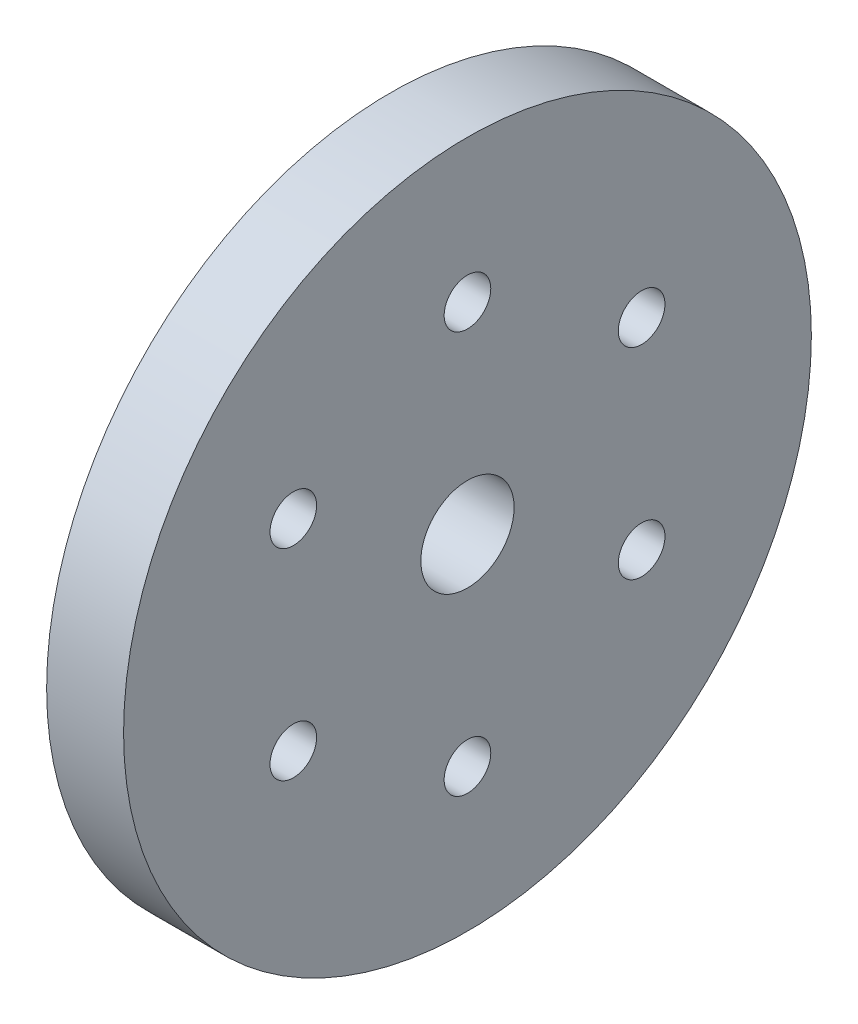
ISO-10303-21;
HEADER;
FILE_DESCRIPTION(('STEP AP214'),'2;1');
FILE_NAME('part.step','',(''),(''),'','','');
FILE_SCHEMA(('AUTOMOTIVE_DESIGN { 1 0 10303 214 1 1 1 1 }'));
ENDSEC;
DATA;
#1=APPLICATION_CONTEXT('core data for automotive mechanical design processes');
#2=APPLICATION_PROTOCOL_DEFINITION('international standard','automotive_design',2000,#1);
#3=PRODUCT_CONTEXT('',#1,'mechanical');
#4=PRODUCT('Part','Part','',(#3));
#5=PRODUCT_RELATED_PRODUCT_CATEGORY('part','',(#4));
#6=PRODUCT_DEFINITION_FORMATION('','',#4);
#7=PRODUCT_DEFINITION_CONTEXT('part definition',#1,'design');
#8=PRODUCT_DEFINITION('design','',#6,#7);
#9=PRODUCT_DEFINITION_SHAPE('','',#8);
#10=(LENGTH_UNIT() NAMED_UNIT(*) SI_UNIT(.MILLI.,.METRE.));
#11=(NAMED_UNIT(*) PLANE_ANGLE_UNIT() SI_UNIT($,.RADIAN.));
#12=(NAMED_UNIT(*) SI_UNIT($,.STERADIAN.) SOLID_ANGLE_UNIT());
#13=UNCERTAINTY_MEASURE_WITH_UNIT(LENGTH_MEASURE(1.E-05),#10,'distance_accuracy_value','');
#14=(GEOMETRIC_REPRESENTATION_CONTEXT(3) GLOBAL_UNCERTAINTY_ASSIGNED_CONTEXT((#13)) GLOBAL_UNIT_ASSIGNED_CONTEXT((#10,
#11,#12)) REPRESENTATION_CONTEXT('',''));
#15=CARTESIAN_POINT('',(0.,0.,0.));
#16=DIRECTION('',(0.,0.,1.));
#17=DIRECTION('',(1.,0.,0.));
#18=AXIS2_PLACEMENT_3D('',#15,#16,#17);
#19=CARTESIAN_POINT('',(6.6,0.,0.));
#20=DIRECTION('',(-1.,0.,0.));
#21=DIRECTION('',(0.,0.,1.));
#22=AXIS2_PLACEMENT_3D('',#19,#20,#21);
#23=CYLINDRICAL_SURFACE('',#22,29.5);
#24=CARTESIAN_POINT('',(6.6,0.,0.));
#25=DIRECTION('',(1.,0.,0.));
#26=DIRECTION('',(0.,0.,-1.));
#27=AXIS2_PLACEMENT_3D('',#24,#25,#26);
#28=CIRCLE('',#27,29.5);
#29=CARTESIAN_POINT('',(6.6,0.,-29.5));
#30=VERTEX_POINT('',#29);
#31=EDGE_CURVE('E10',#30,#30,#28,.T.);
#32=ORIENTED_EDGE('',*,*,#31,.F.);
#33=EDGE_LOOP('',(#32));
#34=FACE_BOUND('',#33,.T.);
#35=CARTESIAN_POINT('',(0.,0.,0.));
#36=DIRECTION('',(1.,0.,0.));
#37=DIRECTION('',(0.,0.,-1.));
#38=AXIS2_PLACEMENT_3D('',#35,#36,#37);
#39=CIRCLE('',#38,29.5);
#40=CARTESIAN_POINT('',(0.,0.,-29.5));
#41=VERTEX_POINT('',#40);
#42=EDGE_CURVE('E38',#41,#41,#39,.T.);
#43=ORIENTED_EDGE('',*,*,#42,.T.);
#44=EDGE_LOOP('',(#43));
#45=FACE_BOUND('',#44,.T.);
#46=ADVANCED_FACE('F35',(#34,#45),#23,.T.);
#47=CARTESIAN_POINT('',(6.6,0.,0.));
#48=DIRECTION('',(1.,0.,0.));
#49=DIRECTION('',(0.,0.,-1.));
#50=AXIS2_PLACEMENT_3D('',#47,#48,#49);
#51=PLANE('',#50);
#52=CARTESIAN_POINT('',(6.6,0.,0.));
#53=DIRECTION('',(1.,0.,0.));
#54=DIRECTION('',(0.,0.,-1.));
#55=AXIS2_PLACEMENT_3D('',#52,#53,#54);
#56=CIRCLE('',#55,4.);
#57=CARTESIAN_POINT('',(6.6,0.,-4.));
#58=VERTEX_POINT('',#57);
#59=EDGE_CURVE('E83',#58,#58,#56,.T.);
#60=ORIENTED_EDGE('',*,*,#59,.F.);
#61=EDGE_LOOP('',(#60));
#62=FACE_BOUND('',#61,.T.);
#63=CARTESIAN_POINT('',(6.6,17.25,0.));
#64=DIRECTION('',(1.,0.,0.));
#65=DIRECTION('',(0.,0.,-1.));
#66=AXIS2_PLACEMENT_3D('',#63,#64,#65);
#67=CIRCLE('',#66,2.);
#68=CARTESIAN_POINT('',(6.6,17.25,-2.));
#69=VERTEX_POINT('',#68);
#70=EDGE_CURVE('E72',#69,#69,#67,.T.);
#71=ORIENTED_EDGE('',*,*,#70,.F.);
#72=EDGE_LOOP('',(#71));
#73=FACE_BOUND('',#72,.T.);
#74=CARTESIAN_POINT('',(6.6,8.62500000000018,14.9389382152815));
#75=DIRECTION('',(1.,0.,0.));
#76=DIRECTION('',(0.,0.,-1.));
#77=AXIS2_PLACEMENT_3D('',#74,#75,#76);
#78=CIRCLE('',#77,2.);
#79=CARTESIAN_POINT('',(6.6,8.62500000000018,12.9389382152815));
#80=VERTEX_POINT('',#79);
#81=EDGE_CURVE('E51',#80,#80,#78,.T.);
#82=ORIENTED_EDGE('',*,*,#81,.F.);
#83=EDGE_LOOP('',(#82));
#84=FACE_BOUND('',#83,.T.);
#85=CARTESIAN_POINT('',(6.6,-8.62499999999986,14.9389382152816));
#86=DIRECTION('',(1.,0.,0.));
#87=DIRECTION('',(0.,0.,-1.));
#88=AXIS2_PLACEMENT_3D('',#85,#86,#87);
#89=CIRCLE('',#88,2.);
#90=CARTESIAN_POINT('',(6.6,-8.62499999999986,12.9389382152816));
#91=VERTEX_POINT('',#90);
#92=EDGE_CURVE('E50',#91,#91,#89,.T.);
#93=ORIENTED_EDGE('',*,*,#92,.F.);
#94=EDGE_LOOP('',(#93));
#95=FACE_BOUND('',#94,.T.);
#96=CARTESIAN_POINT('',(6.6,-17.25,1.20456106190088E-13));
#97=DIRECTION('',(1.,0.,0.));
#98=DIRECTION('',(0.,0.,-1.));
#99=AXIS2_PLACEMENT_3D('',#96,#97,#98);
#100=CIRCLE('',#99,2.);
#101=CARTESIAN_POINT('',(6.6,-17.25,-1.99999999999988));
#102=VERTEX_POINT('',#101);
#103=EDGE_CURVE('E57',#102,#102,#100,.T.);
#104=ORIENTED_EDGE('',*,*,#103,.F.);
#105=EDGE_LOOP('',(#104));
#106=FACE_BOUND('',#105,.T.);
#107=CARTESIAN_POINT('',(6.6,-8.62500000000007,-14.9389382152815));
#108=DIRECTION('',(1.,0.,0.));
#109=DIRECTION('',(0.,0.,-1.));
#110=AXIS2_PLACEMENT_3D('',#107,#108,#109);
#111=CIRCLE('',#110,2.);
#112=CARTESIAN_POINT('',(6.6,-8.62500000000007,-16.9389382152815));
#113=VERTEX_POINT('',#112);
#114=EDGE_CURVE('E63',#113,#113,#111,.T.);
#115=ORIENTED_EDGE('',*,*,#114,.F.);
#116=EDGE_LOOP('',(#115));
#117=FACE_BOUND('',#116,.T.);
#118=CARTESIAN_POINT('',(6.6,8.62499999999997,-14.9389382152816));
#119=DIRECTION('',(1.,0.,0.));
#120=DIRECTION('',(0.,0.,-1.));
#121=AXIS2_PLACEMENT_3D('',#118,#119,#120);
#122=CIRCLE('',#121,2.);
#123=CARTESIAN_POINT('',(6.6,8.62499999999997,-16.9389382152816));
#124=VERTEX_POINT('',#123);
#125=EDGE_CURVE('E69',#124,#124,#122,.T.);
#126=ORIENTED_EDGE('',*,*,#125,.F.);
#127=EDGE_LOOP('',(#126));
#128=FACE_BOUND('',#127,.T.);
#129=ORIENTED_EDGE('',*,*,#31,.T.);
#130=EDGE_LOOP('',(#129));
#131=FACE_BOUND('',#130,.T.);
#132=ADVANCED_FACE('F99',(#62,#73,#84,#95,#106,#117,#128,#131),#51,.T.);
#133=CARTESIAN_POINT('',(0.,0.,0.));
#134=DIRECTION('',(1.,0.,0.));
#135=DIRECTION('',(0.,0.,-1.));
#136=AXIS2_PLACEMENT_3D('',#133,#134,#135);
#137=PLANE('',#136);
#138=CARTESIAN_POINT('',(0.,0.,0.));
#139=DIRECTION('',(1.,0.,0.));
#140=DIRECTION('',(0.,0.,-1.));
#141=AXIS2_PLACEMENT_3D('',#138,#139,#140);
#142=CIRCLE('',#141,4.);
#143=CARTESIAN_POINT('',(0.,0.,-4.));
#144=VERTEX_POINT('',#143);
#145=EDGE_CURVE('E76',#144,#144,#142,.T.);
#146=ORIENTED_EDGE('',*,*,#145,.T.);
#147=EDGE_LOOP('',(#146));
#148=FACE_BOUND('',#147,.T.);
#149=CARTESIAN_POINT('',(0.,17.25,0.));
#150=DIRECTION('',(1.,0.,0.));
#151=DIRECTION('',(0.,0.,-1.));
#152=AXIS2_PLACEMENT_3D('',#149,#150,#151);
#153=CIRCLE('',#152,2.);
#154=CARTESIAN_POINT('',(0.,17.25,-2.));
#155=VERTEX_POINT('',#154);
#156=EDGE_CURVE('E45',#155,#155,#153,.T.);
#157=ORIENTED_EDGE('',*,*,#156,.T.);
#158=EDGE_LOOP('',(#157));
#159=FACE_BOUND('',#158,.T.);
#160=CARTESIAN_POINT('',(0.,8.62500000000018,14.9389382152815));
#161=DIRECTION('',(1.,0.,0.));
#162=DIRECTION('',(0.,0.,-1.));
#163=AXIS2_PLACEMENT_3D('',#160,#161,#162);
#164=CIRCLE('',#163,2.);
#165=CARTESIAN_POINT('',(0.,8.62500000000018,12.9389382152815));
#166=VERTEX_POINT('',#165);
#167=EDGE_CURVE('E73',#166,#166,#164,.T.);
#168=ORIENTED_EDGE('',*,*,#167,.T.);
#169=EDGE_LOOP('',(#168));
#170=FACE_BOUND('',#169,.T.);
#171=CARTESIAN_POINT('',(0.,-8.62499999999986,14.9389382152816));
#172=DIRECTION('',(1.,0.,0.));
#173=DIRECTION('',(0.,0.,-1.));
#174=AXIS2_PLACEMENT_3D('',#171,#172,#173);
#175=CIRCLE('',#174,2.);
#176=CARTESIAN_POINT('',(0.,-8.62499999999986,12.9389382152816));
#177=VERTEX_POINT('',#176);
#178=EDGE_CURVE('E47',#177,#177,#175,.T.);
#179=ORIENTED_EDGE('',*,*,#178,.T.);
#180=EDGE_LOOP('',(#179));
#181=FACE_BOUND('',#180,.T.);
#182=CARTESIAN_POINT('',(0.,-17.25,1.20456106190088E-13));
#183=DIRECTION('',(1.,0.,0.));
#184=DIRECTION('',(0.,0.,-1.));
#185=AXIS2_PLACEMENT_3D('',#182,#183,#184);
#186=CIRCLE('',#185,2.);
#187=CARTESIAN_POINT('',(0.,-17.25,-1.99999999999988));
#188=VERTEX_POINT('',#187);
#189=EDGE_CURVE('E54',#188,#188,#186,.T.);
#190=ORIENTED_EDGE('',*,*,#189,.T.);
#191=EDGE_LOOP('',(#190));
#192=FACE_BOUND('',#191,.T.);
#193=CARTESIAN_POINT('',(0.,-8.62500000000007,-14.9389382152815));
#194=DIRECTION('',(1.,0.,0.));
#195=DIRECTION('',(0.,0.,-1.));
#196=AXIS2_PLACEMENT_3D('',#193,#194,#195);
#197=CIRCLE('',#196,2.);
#198=CARTESIAN_POINT('',(0.,-8.62500000000007,-16.9389382152815));
#199=VERTEX_POINT('',#198);
#200=EDGE_CURVE('E60',#199,#199,#197,.T.);
#201=ORIENTED_EDGE('',*,*,#200,.T.);
#202=EDGE_LOOP('',(#201));
#203=FACE_BOUND('',#202,.T.);
#204=CARTESIAN_POINT('',(0.,8.62499999999997,-14.9389382152816));
#205=DIRECTION('',(1.,0.,0.));
#206=DIRECTION('',(0.,0.,-1.));
#207=AXIS2_PLACEMENT_3D('',#204,#205,#206);
#208=CIRCLE('',#207,2.);
#209=CARTESIAN_POINT('',(0.,8.62499999999997,-16.9389382152816));
#210=VERTEX_POINT('',#209);
#211=EDGE_CURVE('E66',#210,#210,#208,.T.);
#212=ORIENTED_EDGE('',*,*,#211,.T.);
#213=EDGE_LOOP('',(#212));
#214=FACE_BOUND('',#213,.T.);
#215=ORIENTED_EDGE('',*,*,#42,.F.);
#216=EDGE_LOOP('',(#215));
#217=FACE_BOUND('',#216,.T.);
#218=ADVANCED_FACE('F89',(#148,#159,#170,#181,#192,#203,#214,#217),#137,.F.);
#219=CARTESIAN_POINT('',(0.,8.62499999999997,-14.9389382152816));
#220=DIRECTION('',(1.,0.,0.));
#221=DIRECTION('',(0.,0.,-1.));
#222=AXIS2_PLACEMENT_3D('',#219,#220,#221);
#223=CYLINDRICAL_SURFACE('',#222,2.);
#224=ORIENTED_EDGE('',*,*,#211,.F.);
#225=EDGE_LOOP('',(#224));
#226=FACE_BOUND('',#225,.T.);
#227=ORIENTED_EDGE('',*,*,#125,.T.);
#228=EDGE_LOOP('',(#227));
#229=FACE_BOUND('',#228,.T.);
#230=ADVANCED_FACE('F115',(#226,#229),#223,.F.);
#231=CARTESIAN_POINT('',(0.,-8.62500000000007,-14.9389382152815));
#232=DIRECTION('',(1.,0.,0.));
#233=DIRECTION('',(0.,0.,-1.));
#234=AXIS2_PLACEMENT_3D('',#231,#232,#233);
#235=CYLINDRICAL_SURFACE('',#234,2.);
#236=ORIENTED_EDGE('',*,*,#200,.F.);
#237=EDGE_LOOP('',(#236));
#238=FACE_BOUND('',#237,.T.);
#239=ORIENTED_EDGE('',*,*,#114,.T.);
#240=EDGE_LOOP('',(#239));
#241=FACE_BOUND('',#240,.T.);
#242=ADVANCED_FACE('F117',(#238,#241),#235,.F.);
#243=CARTESIAN_POINT('',(0.,-17.25,1.20456106190088E-13));
#244=DIRECTION('',(1.,0.,0.));
#245=DIRECTION('',(0.,0.,-1.));
#246=AXIS2_PLACEMENT_3D('',#243,#244,#245);
#247=CYLINDRICAL_SURFACE('',#246,2.);
#248=ORIENTED_EDGE('',*,*,#189,.F.);
#249=EDGE_LOOP('',(#248));
#250=FACE_BOUND('',#249,.T.);
#251=ORIENTED_EDGE('',*,*,#103,.T.);
#252=EDGE_LOOP('',(#251));
#253=FACE_BOUND('',#252,.T.);
#254=ADVANCED_FACE('F124',(#250,#253),#247,.F.);
#255=CARTESIAN_POINT('',(0.,-8.62499999999986,14.9389382152816));
#256=DIRECTION('',(1.,0.,0.));
#257=DIRECTION('',(0.,0.,-1.));
#258=AXIS2_PLACEMENT_3D('',#255,#256,#257);
#259=CYLINDRICAL_SURFACE('',#258,2.);
#260=ORIENTED_EDGE('',*,*,#178,.F.);
#261=EDGE_LOOP('',(#260));
#262=FACE_BOUND('',#261,.T.);
#263=ORIENTED_EDGE('',*,*,#92,.T.);
#264=EDGE_LOOP('',(#263));
#265=FACE_BOUND('',#264,.T.);
#266=ADVANCED_FACE('F169',(#262,#265),#259,.F.);
#267=CARTESIAN_POINT('',(0.,8.62500000000018,14.9389382152815));
#268=DIRECTION('',(1.,0.,0.));
#269=DIRECTION('',(0.,0.,-1.));
#270=AXIS2_PLACEMENT_3D('',#267,#268,#269);
#271=CYLINDRICAL_SURFACE('',#270,2.);
#272=ORIENTED_EDGE('',*,*,#167,.F.);
#273=EDGE_LOOP('',(#272));
#274=FACE_BOUND('',#273,.T.);
#275=ORIENTED_EDGE('',*,*,#81,.T.);
#276=EDGE_LOOP('',(#275));
#277=FACE_BOUND('',#276,.T.);
#278=ADVANCED_FACE('F162',(#274,#277),#271,.F.);
#279=CARTESIAN_POINT('',(0.,17.25,0.));
#280=DIRECTION('',(1.,0.,0.));
#281=DIRECTION('',(0.,0.,-1.));
#282=AXIS2_PLACEMENT_3D('',#279,#280,#281);
#283=CYLINDRICAL_SURFACE('',#282,2.);
#284=ORIENTED_EDGE('',*,*,#156,.F.);
#285=EDGE_LOOP('',(#284));
#286=FACE_BOUND('',#285,.T.);
#287=ORIENTED_EDGE('',*,*,#70,.T.);
#288=EDGE_LOOP('',(#287));
#289=FACE_BOUND('',#288,.T.);
#290=ADVANCED_FACE('F95',(#286,#289),#283,.F.);
#291=CARTESIAN_POINT('',(0.,0.,0.));
#292=DIRECTION('',(1.,0.,0.));
#293=DIRECTION('',(0.,0.,-1.));
#294=AXIS2_PLACEMENT_3D('',#291,#292,#293);
#295=CYLINDRICAL_SURFACE('',#294,4.);
#296=ORIENTED_EDGE('',*,*,#145,.F.);
#297=EDGE_LOOP('',(#296));
#298=FACE_BOUND('',#297,.T.);
#299=ORIENTED_EDGE('',*,*,#59,.T.);
#300=EDGE_LOOP('',(#299));
#301=FACE_BOUND('',#300,.T.);
#302=ADVANCED_FACE('F92',(#298,#301),#295,.F.);
#303=CLOSED_SHELL('',(#46,#132,#218,#230,#242,#254,#266,#278,#290,#302));
#304=MANIFOLD_SOLID_BREP('B2',#303);
#305=ADVANCED_BREP_SHAPE_REPRESENTATION('',(#18,#304),#14);
#306=SHAPE_DEFINITION_REPRESENTATION(#9,#305);
ENDSEC;
END-ISO-10303-21;
